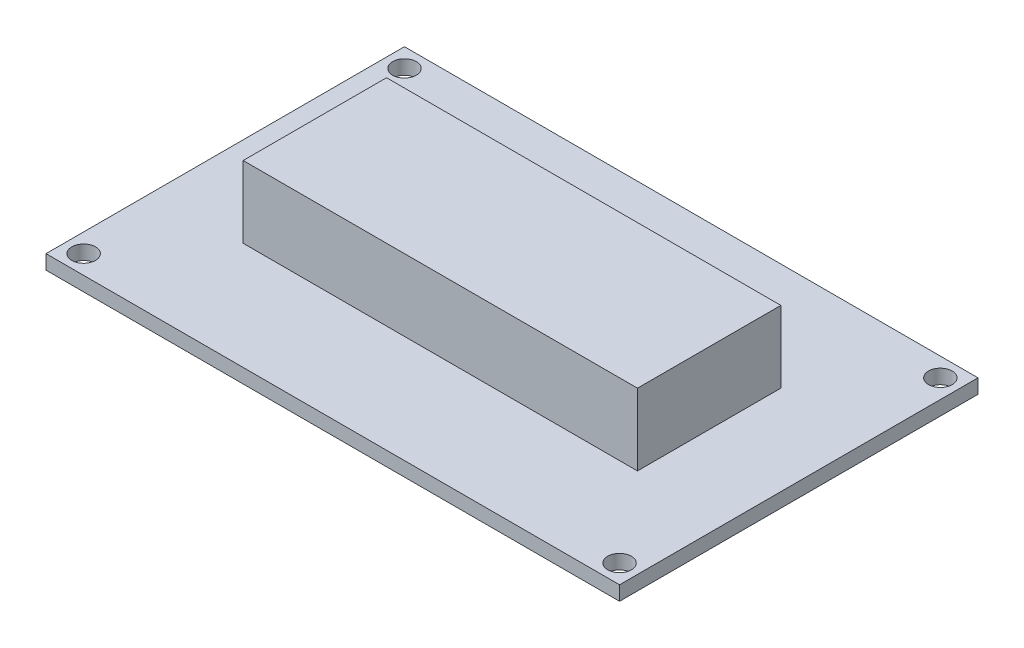
ISO-10303-21;
HEADER;
FILE_DESCRIPTION(('STEP AP214'),'2;1');
FILE_NAME('part.step','',(''),(''),'','','');
FILE_SCHEMA(('AUTOMOTIVE_DESIGN { 1 0 10303 214 1 1 1 1 }'));
ENDSEC;
DATA;
#1=APPLICATION_CONTEXT('core data for automotive mechanical design processes');
#2=APPLICATION_PROTOCOL_DEFINITION('international standard','automotive_design',2000,#1);
#3=PRODUCT_CONTEXT('',#1,'mechanical');
#4=PRODUCT('Part','Part','',(#3));
#5=PRODUCT_RELATED_PRODUCT_CATEGORY('part','',(#4));
#6=PRODUCT_DEFINITION_FORMATION('','',#4);
#7=PRODUCT_DEFINITION_CONTEXT('part definition',#1,'design');
#8=PRODUCT_DEFINITION('design','',#6,#7);
#9=PRODUCT_DEFINITION_SHAPE('','',#8);
#10=(LENGTH_UNIT() NAMED_UNIT(*) SI_UNIT(.MILLI.,.METRE.));
#11=(NAMED_UNIT(*) PLANE_ANGLE_UNIT() SI_UNIT($,.RADIAN.));
#12=(NAMED_UNIT(*) SI_UNIT($,.STERADIAN.) SOLID_ANGLE_UNIT());
#13=UNCERTAINTY_MEASURE_WITH_UNIT(LENGTH_MEASURE(1.E-05),#10,'distance_accuracy_value','');
#14=(GEOMETRIC_REPRESENTATION_CONTEXT(3) GLOBAL_UNCERTAINTY_ASSIGNED_CONTEXT((#13)) GLOBAL_UNIT_ASSIGNED_CONTEXT((#10,
#11,#12)) REPRESENTATION_CONTEXT('',''));
#15=CARTESIAN_POINT('',(0.,0.,0.));
#16=DIRECTION('',(0.,0.,1.));
#17=DIRECTION('',(1.,0.,0.));
#18=AXIS2_PLACEMENT_3D('',#15,#16,#17);
#19=CARTESIAN_POINT('',(80.,2.,0.));
#20=DIRECTION('',(-1.,0.,0.));
#21=DIRECTION('',(0.,0.,1.));
#22=AXIS2_PLACEMENT_3D('',#19,#20,#21);
#23=PLANE('',#22);
#24=DIRECTION('',(0.,0.,-1.));
#25=VECTOR('',#24,1.);
#26=CARTESIAN_POINT('',(80.,0.,0.));
#27=LINE('',#26,#25);
#28=CARTESIAN_POINT('',(80.,0.,0.));
#29=VERTEX_POINT('',#28);
#30=CARTESIAN_POINT('',(80.,0.,-50.));
#31=VERTEX_POINT('',#30);
#32=EDGE_CURVE('E128',#29,#31,#27,.T.);
#33=ORIENTED_EDGE('',*,*,#32,.T.);
#34=DIRECTION('',(0.,-1.,0.));
#35=VECTOR('',#34,1.);
#36=CARTESIAN_POINT('',(80.,2.,-50.));
#37=LINE('',#36,#35);
#38=CARTESIAN_POINT('',(80.,2.,-50.));
#39=VERTEX_POINT('',#38);
#40=EDGE_CURVE('E11',#39,#31,#37,.T.);
#41=ORIENTED_EDGE('',*,*,#40,.F.);
#42=DIRECTION('',(0.,0.,-1.));
#43=VECTOR('',#42,1.);
#44=CARTESIAN_POINT('',(80.,2.,0.));
#45=LINE('',#44,#43);
#46=CARTESIAN_POINT('',(80.,2.,0.));
#47=VERTEX_POINT('',#46);
#48=EDGE_CURVE('E139',#47,#39,#45,.T.);
#49=ORIENTED_EDGE('',*,*,#48,.F.);
#50=DIRECTION('',(0.,-1.,0.));
#51=VECTOR('',#50,1.);
#52=CARTESIAN_POINT('',(80.,2.,0.));
#53=LINE('',#52,#51);
#54=EDGE_CURVE('E169',#47,#29,#53,.T.);
#55=ORIENTED_EDGE('',*,*,#54,.T.);
#56=EDGE_LOOP('',(#33,#41,#49,#55));
#57=FACE_BOUND('',#56,.T.);
#58=ADVANCED_FACE('F41',(#57),#23,.F.);
#59=CARTESIAN_POINT('',(0.,2.,-50.));
#60=DIRECTION('',(0.,0.,-1.));
#61=DIRECTION('',(-1.,0.,0.));
#62=AXIS2_PLACEMENT_3D('',#59,#60,#61);
#63=PLANE('',#62);
#64=DIRECTION('',(1.,0.,0.));
#65=VECTOR('',#64,1.);
#66=CARTESIAN_POINT('',(0.,0.,-50.));
#67=LINE('',#66,#65);
#68=CARTESIAN_POINT('',(0.,0.,-50.));
#69=VERTEX_POINT('',#68);
#70=EDGE_CURVE('E133',#69,#31,#67,.T.);
#71=ORIENTED_EDGE('',*,*,#70,.F.);
#72=DIRECTION('',(0.,-1.,0.));
#73=VECTOR('',#72,1.);
#74=CARTESIAN_POINT('',(0.,2.,-50.));
#75=LINE('',#74,#73);
#76=CARTESIAN_POINT('',(0.,2.,-50.));
#77=VERTEX_POINT('',#76);
#78=EDGE_CURVE('E49',#77,#69,#75,.T.);
#79=ORIENTED_EDGE('',*,*,#78,.F.);
#80=DIRECTION('',(1.,0.,0.));
#81=VECTOR('',#80,1.);
#82=CARTESIAN_POINT('',(0.,2.,-50.));
#83=LINE('',#82,#81);
#84=EDGE_CURVE('E142',#77,#39,#83,.T.);
#85=ORIENTED_EDGE('',*,*,#84,.T.);
#86=ORIENTED_EDGE('',*,*,#40,.T.);
#87=EDGE_LOOP('',(#71,#79,#85,#86));
#88=FACE_BOUND('',#87,.T.);
#89=ADVANCED_FACE('F209',(#88),#63,.T.);
#90=CARTESIAN_POINT('',(0.,2.,0.));
#91=DIRECTION('',(-1.,0.,0.));
#92=DIRECTION('',(0.,0.,1.));
#93=AXIS2_PLACEMENT_3D('',#90,#91,#92);
#94=PLANE('',#93);
#95=DIRECTION('',(0.,0.,-1.));
#96=VECTOR('',#95,1.);
#97=CARTESIAN_POINT('',(0.,0.,0.));
#98=LINE('',#97,#96);
#99=CARTESIAN_POINT('',(0.,0.,0.));
#100=VERTEX_POINT('',#99);
#101=EDGE_CURVE('E174',#100,#69,#98,.T.);
#102=ORIENTED_EDGE('',*,*,#101,.F.);
#103=DIRECTION('',(0.,-1.,0.));
#104=VECTOR('',#103,1.);
#105=CARTESIAN_POINT('',(0.,2.,0.));
#106=LINE('',#105,#104);
#107=CARTESIAN_POINT('',(0.,2.,0.));
#108=VERTEX_POINT('',#107);
#109=EDGE_CURVE('E199',#108,#100,#106,.T.);
#110=ORIENTED_EDGE('',*,*,#109,.F.);
#111=DIRECTION('',(0.,0.,-1.));
#112=VECTOR('',#111,1.);
#113=CARTESIAN_POINT('',(0.,2.,0.));
#114=LINE('',#113,#112);
#115=EDGE_CURVE('E147',#108,#77,#114,.T.);
#116=ORIENTED_EDGE('',*,*,#115,.T.);
#117=ORIENTED_EDGE('',*,*,#78,.T.);
#118=EDGE_LOOP('',(#102,#110,#116,#117));
#119=FACE_BOUND('',#118,.T.);
#120=ADVANCED_FACE('F205',(#119),#94,.T.);
#121=CARTESIAN_POINT('',(77.375,2.,-2.625));
#122=DIRECTION('',(0.,-1.,0.));
#123=DIRECTION('',(0.,0.,-1.));
#124=AXIS2_PLACEMENT_3D('',#121,#122,#123);
#125=CYLINDRICAL_SURFACE('',#124,1.65);
#126=CARTESIAN_POINT('',(77.375,2.,-2.625));
#127=DIRECTION('',(0.,1.,0.));
#128=DIRECTION('',(0.,0.,1.));
#129=AXIS2_PLACEMENT_3D('',#126,#127,#128);
#130=CIRCLE('',#129,1.65);
#131=CARTESIAN_POINT('',(77.375,2.,-0.975000000000001));
#132=VERTEX_POINT('',#131);
#133=EDGE_CURVE('E162',#132,#132,#130,.T.);
#134=ORIENTED_EDGE('',*,*,#133,.T.);
#135=EDGE_LOOP('',(#134));
#136=FACE_BOUND('',#135,.T.);
#137=CARTESIAN_POINT('',(77.375,0.,-2.625));
#138=DIRECTION('',(0.,1.,0.));
#139=DIRECTION('',(0.,0.,1.));
#140=AXIS2_PLACEMENT_3D('',#137,#138,#139);
#141=CIRCLE('',#140,1.65);
#142=CARTESIAN_POINT('',(77.375,0.,-0.975000000000001));
#143=VERTEX_POINT('',#142);
#144=EDGE_CURVE('E189',#143,#143,#141,.T.);
#145=ORIENTED_EDGE('',*,*,#144,.F.);
#146=EDGE_LOOP('',(#145));
#147=FACE_BOUND('',#146,.T.);
#148=ADVANCED_FACE('F254',(#136,#147),#125,.F.);
#149=CARTESIAN_POINT('',(2.625,2.,-47.375));
#150=DIRECTION('',(0.,-1.,0.));
#151=DIRECTION('',(0.,0.,-1.));
#152=AXIS2_PLACEMENT_3D('',#149,#150,#151);
#153=CYLINDRICAL_SURFACE('',#152,1.65);
#154=CARTESIAN_POINT('',(2.625,2.,-47.375));
#155=DIRECTION('',(0.,1.,0.));
#156=DIRECTION('',(0.,0.,1.));
#157=AXIS2_PLACEMENT_3D('',#154,#155,#156);
#158=CIRCLE('',#157,1.65);
#159=CARTESIAN_POINT('',(2.625,2.,-45.725));
#160=VERTEX_POINT('',#159);
#161=EDGE_CURVE('E158',#160,#160,#158,.T.);
#162=ORIENTED_EDGE('',*,*,#161,.T.);
#163=EDGE_LOOP('',(#162));
#164=FACE_BOUND('',#163,.T.);
#165=CARTESIAN_POINT('',(2.625,0.,-47.375));
#166=DIRECTION('',(0.,1.,0.));
#167=DIRECTION('',(0.,0.,1.));
#168=AXIS2_PLACEMENT_3D('',#165,#166,#167);
#169=CIRCLE('',#168,1.65);
#170=CARTESIAN_POINT('',(2.625,0.,-45.725));
#171=VERTEX_POINT('',#170);
#172=EDGE_CURVE('E185',#171,#171,#169,.T.);
#173=ORIENTED_EDGE('',*,*,#172,.F.);
#174=EDGE_LOOP('',(#173));
#175=FACE_BOUND('',#174,.T.);
#176=ADVANCED_FACE('F262',(#164,#175),#153,.F.);
#177=CARTESIAN_POINT('',(77.375,2.,-47.375));
#178=DIRECTION('',(0.,-1.,0.));
#179=DIRECTION('',(0.,0.,-1.));
#180=AXIS2_PLACEMENT_3D('',#177,#178,#179);
#181=CYLINDRICAL_SURFACE('',#180,1.65);
#182=CARTESIAN_POINT('',(77.375,2.,-47.375));
#183=DIRECTION('',(0.,1.,0.));
#184=DIRECTION('',(0.,0.,1.));
#185=AXIS2_PLACEMENT_3D('',#182,#183,#184);
#186=CIRCLE('',#185,1.65);
#187=CARTESIAN_POINT('',(77.375,2.,-45.725));
#188=VERTEX_POINT('',#187);
#189=EDGE_CURVE('E154',#188,#188,#186,.T.);
#190=ORIENTED_EDGE('',*,*,#189,.T.);
#191=EDGE_LOOP('',(#190));
#192=FACE_BOUND('',#191,.T.);
#193=CARTESIAN_POINT('',(77.375,0.,-47.375));
#194=DIRECTION('',(0.,1.,0.));
#195=DIRECTION('',(0.,0.,1.));
#196=AXIS2_PLACEMENT_3D('',#193,#194,#195);
#197=CIRCLE('',#196,1.65);
#198=CARTESIAN_POINT('',(77.375,0.,-45.725));
#199=VERTEX_POINT('',#198);
#200=EDGE_CURVE('E181',#199,#199,#197,.T.);
#201=ORIENTED_EDGE('',*,*,#200,.F.);
#202=EDGE_LOOP('',(#201));
#203=FACE_BOUND('',#202,.T.);
#204=ADVANCED_FACE('F259',(#192,#203),#181,.F.);
#205=CARTESIAN_POINT('',(0.,2.,0.));
#206=DIRECTION('',(0.,0.,-1.));
#207=DIRECTION('',(-1.,0.,0.));
#208=AXIS2_PLACEMENT_3D('',#205,#206,#207);
#209=PLANE('',#208);
#210=DIRECTION('',(1.,0.,0.));
#211=VECTOR('',#210,1.);
#212=CARTESIAN_POINT('',(0.,0.,0.));
#213=LINE('',#212,#211);
#214=EDGE_CURVE('E178',#100,#29,#213,.T.);
#215=ORIENTED_EDGE('',*,*,#214,.T.);
#216=ORIENTED_EDGE('',*,*,#54,.F.);
#217=DIRECTION('',(1.,0.,0.));
#218=VECTOR('',#217,1.);
#219=CARTESIAN_POINT('',(0.,2.,0.));
#220=LINE('',#219,#218);
#221=EDGE_CURVE('E151',#108,#47,#220,.T.);
#222=ORIENTED_EDGE('',*,*,#221,.F.);
#223=ORIENTED_EDGE('',*,*,#109,.T.);
#224=EDGE_LOOP('',(#215,#216,#222,#223));
#225=FACE_BOUND('',#224,.T.);
#226=ADVANCED_FACE('F218',(#225),#209,.F.);
#227=CARTESIAN_POINT('',(2.625,2.,-2.625));
#228=DIRECTION('',(0.,-1.,0.));
#229=DIRECTION('',(0.,0.,-1.));
#230=AXIS2_PLACEMENT_3D('',#227,#228,#229);
#231=CYLINDRICAL_SURFACE('',#230,1.65);
#232=CARTESIAN_POINT('',(2.625,2.,-2.625));
#233=DIRECTION('',(0.,1.,0.));
#234=DIRECTION('',(0.,0.,1.));
#235=AXIS2_PLACEMENT_3D('',#232,#233,#234);
#236=CIRCLE('',#235,1.65);
#237=CARTESIAN_POINT('',(2.625,2.,-0.975000000000002));
#238=VERTEX_POINT('',#237);
#239=EDGE_CURVE('E166',#238,#238,#236,.T.);
#240=ORIENTED_EDGE('',*,*,#239,.T.);
#241=EDGE_LOOP('',(#240));
#242=FACE_BOUND('',#241,.T.);
#243=CARTESIAN_POINT('',(2.625,0.,-2.625));
#244=DIRECTION('',(0.,1.,0.));
#245=DIRECTION('',(0.,0.,1.));
#246=AXIS2_PLACEMENT_3D('',#243,#244,#245);
#247=CIRCLE('',#246,1.65);
#248=CARTESIAN_POINT('',(2.625,0.,-0.975000000000002));
#249=VERTEX_POINT('',#248);
#250=EDGE_CURVE('E143',#249,#249,#247,.T.);
#251=ORIENTED_EDGE('',*,*,#250,.F.);
#252=EDGE_LOOP('',(#251));
#253=FACE_BOUND('',#252,.T.);
#254=ADVANCED_FACE('F226',(#242,#253),#231,.F.);
#255=CARTESIAN_POINT('',(0.,2.,0.));
#256=DIRECTION('',(0.,1.,0.));
#257=DIRECTION('',(0.,0.,1.));
#258=AXIS2_PLACEMENT_3D('',#255,#256,#257);
#259=PLANE('',#258);
#260=DIRECTION('',(0.,0.,1.));
#261=VECTOR('',#260,1.);
#262=CARTESIAN_POINT('',(12.5,2.,-35.));
#263=LINE('',#262,#261);
#264=CARTESIAN_POINT('',(12.5,2.,-35.));
#265=VERTEX_POINT('',#264);
#266=CARTESIAN_POINT('',(12.5,2.,-15.));
#267=VERTEX_POINT('',#266);
#268=EDGE_CURVE('E56',#265,#267,#263,.T.);
#269=ORIENTED_EDGE('',*,*,#268,.F.);
#270=DIRECTION('',(-1.,0.,0.));
#271=VECTOR('',#270,1.);
#272=CARTESIAN_POINT('',(12.5,2.,-35.));
#273=LINE('',#272,#271);
#274=CARTESIAN_POINT('',(67.5,2.,-35.));
#275=VERTEX_POINT('',#274);
#276=EDGE_CURVE('E60',#275,#265,#273,.T.);
#277=ORIENTED_EDGE('',*,*,#276,.F.);
#278=DIRECTION('',(0.,0.,-1.));
#279=VECTOR('',#278,1.);
#280=CARTESIAN_POINT('',(67.5,2.,-35.));
#281=LINE('',#280,#279);
#282=CARTESIAN_POINT('',(67.5,2.,-15.));
#283=VERTEX_POINT('',#282);
#284=EDGE_CURVE('E376',#283,#275,#281,.T.);
#285=ORIENTED_EDGE('',*,*,#284,.F.);
#286=DIRECTION('',(1.,0.,0.));
#287=VECTOR('',#286,1.);
#288=CARTESIAN_POINT('',(12.5,2.,-15.));
#289=LINE('',#288,#287);
#290=EDGE_CURVE('E386',#267,#283,#289,.T.);
#291=ORIENTED_EDGE('',*,*,#290,.F.);
#292=EDGE_LOOP('',(#269,#277,#285,#291));
#293=FACE_BOUND('',#292,.T.);
#294=ORIENTED_EDGE('',*,*,#48,.T.);
#295=ORIENTED_EDGE('',*,*,#84,.F.);
#296=ORIENTED_EDGE('',*,*,#115,.F.);
#297=ORIENTED_EDGE('',*,*,#221,.T.);
#298=EDGE_LOOP('',(#294,#295,#296,#297));
#299=FACE_BOUND('',#298,.T.);
#300=ORIENTED_EDGE('',*,*,#189,.F.);
#301=EDGE_LOOP('',(#300));
#302=FACE_BOUND('',#301,.T.);
#303=ORIENTED_EDGE('',*,*,#161,.F.);
#304=EDGE_LOOP('',(#303));
#305=FACE_BOUND('',#304,.T.);
#306=ORIENTED_EDGE('',*,*,#133,.F.);
#307=EDGE_LOOP('',(#306));
#308=FACE_BOUND('',#307,.T.);
#309=ORIENTED_EDGE('',*,*,#239,.F.);
#310=EDGE_LOOP('',(#309));
#311=FACE_BOUND('',#310,.T.);
#312=ADVANCED_FACE('F223',(#293,#299,#302,#305,#308,#311),#259,.T.);
#313=CARTESIAN_POINT('',(0.,0.,0.));
#314=DIRECTION('',(0.,1.,0.));
#315=DIRECTION('',(0.,0.,1.));
#316=AXIS2_PLACEMENT_3D('',#313,#314,#315);
#317=PLANE('',#316);
#318=ORIENTED_EDGE('',*,*,#32,.F.);
#319=ORIENTED_EDGE('',*,*,#214,.F.);
#320=ORIENTED_EDGE('',*,*,#101,.T.);
#321=ORIENTED_EDGE('',*,*,#70,.T.);
#322=EDGE_LOOP('',(#318,#319,#320,#321));
#323=FACE_BOUND('',#322,.T.);
#324=ORIENTED_EDGE('',*,*,#200,.T.);
#325=EDGE_LOOP('',(#324));
#326=FACE_BOUND('',#325,.T.);
#327=ORIENTED_EDGE('',*,*,#172,.T.);
#328=EDGE_LOOP('',(#327));
#329=FACE_BOUND('',#328,.T.);
#330=ORIENTED_EDGE('',*,*,#144,.T.);
#331=EDGE_LOOP('',(#330));
#332=FACE_BOUND('',#331,.T.);
#333=ORIENTED_EDGE('',*,*,#250,.T.);
#334=EDGE_LOOP('',(#333));
#335=FACE_BOUND('',#334,.T.);
#336=ADVANCED_FACE('F214',(#323,#326,#329,#332,#335),#317,.F.);
#337=CARTESIAN_POINT('',(12.5,12.,-35.));
#338=DIRECTION('',(1.,0.,0.));
#339=DIRECTION('',(0.,0.,-1.));
#340=AXIS2_PLACEMENT_3D('',#337,#338,#339);
#341=PLANE('',#340);
#342=ORIENTED_EDGE('',*,*,#268,.T.);
#343=DIRECTION('',(0.,-1.,0.));
#344=VECTOR('',#343,1.);
#345=CARTESIAN_POINT('',(12.5,12.,-15.));
#346=LINE('',#345,#344);
#347=CARTESIAN_POINT('',(12.5,12.,-15.));
#348=VERTEX_POINT('',#347);
#349=EDGE_CURVE('E108',#348,#267,#346,.T.);
#350=ORIENTED_EDGE('',*,*,#349,.F.);
#351=DIRECTION('',(0.,0.,1.));
#352=VECTOR('',#351,1.);
#353=CARTESIAN_POINT('',(12.5,12.,-35.));
#354=LINE('',#353,#352);
#355=CARTESIAN_POINT('',(12.5,12.,-35.));
#356=VERTEX_POINT('',#355);
#357=EDGE_CURVE('E115',#356,#348,#354,.T.);
#358=ORIENTED_EDGE('',*,*,#357,.F.);
#359=DIRECTION('',(0.,-1.,0.));
#360=VECTOR('',#359,1.);
#361=CARTESIAN_POINT('',(12.5,12.,-35.));
#362=LINE('',#361,#360);
#363=EDGE_CURVE('E373',#356,#265,#362,.T.);
#364=ORIENTED_EDGE('',*,*,#363,.T.);
#365=EDGE_LOOP('',(#342,#350,#358,#364));
#366=FACE_BOUND('',#365,.T.);
#367=ADVANCED_FACE('F126',(#366),#341,.F.);
#368=CARTESIAN_POINT('',(12.5,12.,-15.));
#369=DIRECTION('',(0.,0.,-1.));
#370=DIRECTION('',(-1.,0.,0.));
#371=AXIS2_PLACEMENT_3D('',#368,#369,#370);
#372=PLANE('',#371);
#373=ORIENTED_EDGE('',*,*,#290,.T.);
#374=DIRECTION('',(0.,-1.,0.));
#375=VECTOR('',#374,1.);
#376=CARTESIAN_POINT('',(67.5,12.,-15.));
#377=LINE('',#376,#375);
#378=CARTESIAN_POINT('',(67.5,12.,-15.));
#379=VERTEX_POINT('',#378);
#380=EDGE_CURVE('E110',#379,#283,#377,.T.);
#381=ORIENTED_EDGE('',*,*,#380,.F.);
#382=DIRECTION('',(1.,0.,0.));
#383=VECTOR('',#382,1.);
#384=CARTESIAN_POINT('',(12.5,12.,-15.));
#385=LINE('',#384,#383);
#386=EDGE_CURVE('E103',#348,#379,#385,.T.);
#387=ORIENTED_EDGE('',*,*,#386,.F.);
#388=ORIENTED_EDGE('',*,*,#349,.T.);
#389=EDGE_LOOP('',(#373,#381,#387,#388));
#390=FACE_BOUND('',#389,.T.);
#391=ADVANCED_FACE('F106',(#390),#372,.F.);
#392=CARTESIAN_POINT('',(67.5,12.,-35.));
#393=DIRECTION('',(-1.,0.,0.));
#394=DIRECTION('',(0.,0.,1.));
#395=AXIS2_PLACEMENT_3D('',#392,#393,#394);
#396=PLANE('',#395);
#397=ORIENTED_EDGE('',*,*,#284,.T.);
#398=DIRECTION('',(0.,-1.,0.));
#399=VECTOR('',#398,1.);
#400=CARTESIAN_POINT('',(67.5,12.,-35.));
#401=LINE('',#400,#399);
#402=CARTESIAN_POINT('',(67.5,12.,-35.));
#403=VERTEX_POINT('',#402);
#404=EDGE_CURVE('E135',#403,#275,#401,.T.);
#405=ORIENTED_EDGE('',*,*,#404,.F.);
#406=DIRECTION('',(0.,0.,-1.));
#407=VECTOR('',#406,1.);
#408=CARTESIAN_POINT('',(67.5,12.,-35.));
#409=LINE('',#408,#407);
#410=EDGE_CURVE('E114',#379,#403,#409,.T.);
#411=ORIENTED_EDGE('',*,*,#410,.F.);
#412=ORIENTED_EDGE('',*,*,#380,.T.);
#413=EDGE_LOOP('',(#397,#405,#411,#412));
#414=FACE_BOUND('',#413,.T.);
#415=ADVANCED_FACE('F305',(#414),#396,.F.);
#416=CARTESIAN_POINT('',(12.5,12.,-35.));
#417=DIRECTION('',(0.,0.,1.));
#418=DIRECTION('',(1.,0.,0.));
#419=AXIS2_PLACEMENT_3D('',#416,#417,#418);
#420=PLANE('',#419);
#421=ORIENTED_EDGE('',*,*,#276,.T.);
#422=ORIENTED_EDGE('',*,*,#363,.F.);
#423=DIRECTION('',(-1.,0.,0.));
#424=VECTOR('',#423,1.);
#425=CARTESIAN_POINT('',(12.5,12.,-35.));
#426=LINE('',#425,#424);
#427=EDGE_CURVE('E120',#403,#356,#426,.T.);
#428=ORIENTED_EDGE('',*,*,#427,.F.);
#429=ORIENTED_EDGE('',*,*,#404,.T.);
#430=EDGE_LOOP('',(#421,#422,#428,#429));
#431=FACE_BOUND('',#430,.T.);
#432=ADVANCED_FACE('F315',(#431),#420,.F.);
#433=CARTESIAN_POINT('',(0.,12.,0.));
#434=DIRECTION('',(0.,1.,0.));
#435=DIRECTION('',(0.,0.,1.));
#436=AXIS2_PLACEMENT_3D('',#433,#434,#435);
#437=PLANE('',#436);
#438=ORIENTED_EDGE('',*,*,#357,.T.);
#439=ORIENTED_EDGE('',*,*,#386,.T.);
#440=ORIENTED_EDGE('',*,*,#410,.T.);
#441=ORIENTED_EDGE('',*,*,#427,.T.);
#442=EDGE_LOOP('',(#438,#439,#440,#441));
#443=FACE_BOUND('',#442,.T.);
#444=ADVANCED_FACE('F118',(#443),#437,.T.);
#445=CLOSED_SHELL('',(#58,#89,#120,#148,#176,#204,#226,#254,#312,#336,#367,#391,#415,#432,#444));
#446=MANIFOLD_SOLID_BREP('B2',#445);
#447=ADVANCED_BREP_SHAPE_REPRESENTATION('',(#18,#446),#14);
#448=SHAPE_DEFINITION_REPRESENTATION(#9,#447);
ENDSEC;
END-ISO-10303-21;
